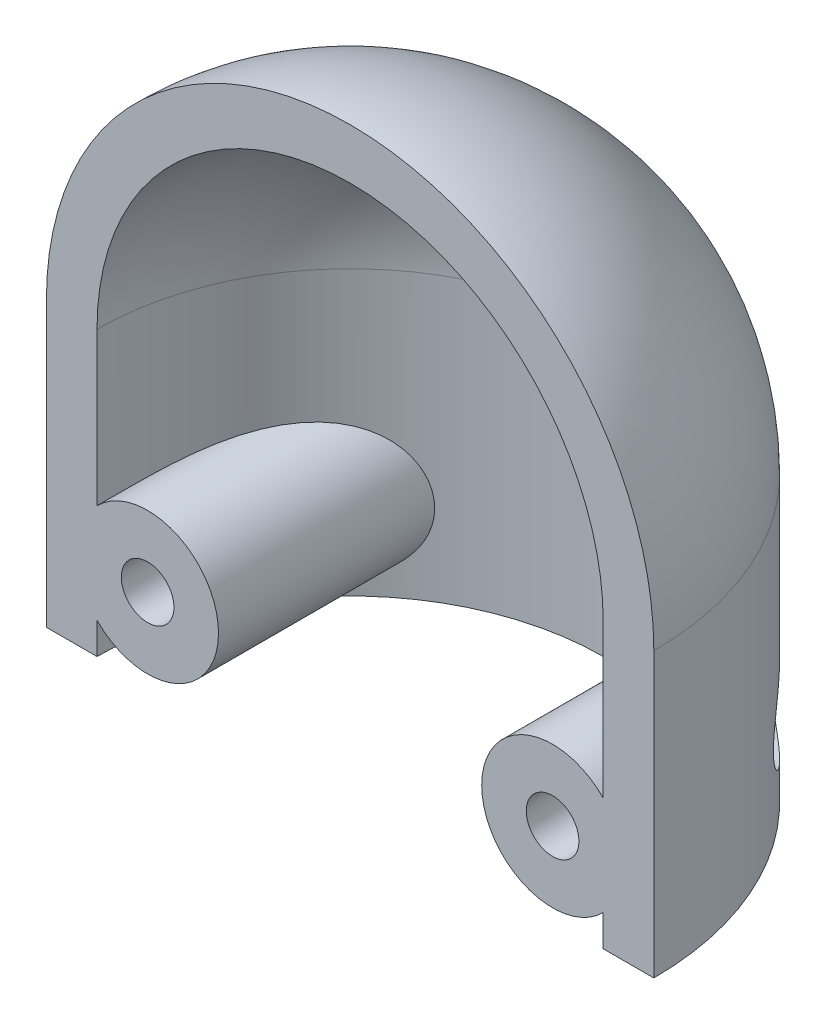
ISO-10303-21;
HEADER;
FILE_DESCRIPTION(('STEP AP214'),'2;1');
FILE_NAME('part.step','',(''),(''),'','','');
FILE_SCHEMA(('AUTOMOTIVE_DESIGN { 1 0 10303 214 1 1 1 1 }'));
ENDSEC;
DATA;
#1=APPLICATION_CONTEXT('core data for automotive mechanical design processes');
#2=APPLICATION_PROTOCOL_DEFINITION('international standard','automotive_design',2000,#1);
#3=PRODUCT_CONTEXT('',#1,'mechanical');
#4=PRODUCT('Part','Part','',(#3));
#5=PRODUCT_RELATED_PRODUCT_CATEGORY('part','',(#4));
#6=PRODUCT_DEFINITION_FORMATION('','',#4);
#7=PRODUCT_DEFINITION_CONTEXT('part definition',#1,'design');
#8=PRODUCT_DEFINITION('design','',#6,#7);
#9=PRODUCT_DEFINITION_SHAPE('','',#8);
#10=(LENGTH_UNIT() NAMED_UNIT(*) SI_UNIT(.MILLI.,.METRE.));
#11=(NAMED_UNIT(*) PLANE_ANGLE_UNIT() SI_UNIT($,.RADIAN.));
#12=(NAMED_UNIT(*) SI_UNIT($,.STERADIAN.) SOLID_ANGLE_UNIT());
#13=UNCERTAINTY_MEASURE_WITH_UNIT(LENGTH_MEASURE(1.E-05),#10,'distance_accuracy_value','');
#14=(GEOMETRIC_REPRESENTATION_CONTEXT(3) GLOBAL_UNCERTAINTY_ASSIGNED_CONTEXT((#13)) GLOBAL_UNIT_ASSIGNED_CONTEXT((#10,
#11,#12)) REPRESENTATION_CONTEXT('',''));
#15=CARTESIAN_POINT('',(0.,0.,0.));
#16=DIRECTION('',(0.,0.,1.));
#17=DIRECTION('',(1.,0.,0.));
#18=AXIS2_PLACEMENT_3D('',#15,#16,#17);
#19=CARTESIAN_POINT('',(0.,26.5,0.));
#20=DIRECTION('',(0.,1.,0.));
#21=DIRECTION('',(-1.,0.,0.));
#22=AXIS2_PLACEMENT_3D('',#19,#20,#21);
#23=CYLINDRICAL_SURFACE('',#22,15.);
#24=CARTESIAN_POINT('',(-7.75,1.5,-12.8427995390413));
#25=CARTESIAN_POINT('',(-7.75000762208717,1.38797182523697,-12.8427963613873));
#26=CARTESIAN_POINT('',(-7.758414467191,1.27586634677356,-12.8377334470978));
#27=CARTESIAN_POINT('',(-7.79161643382535,1.05497367886992,-12.8176078864283));
#28=CARTESIAN_POINT('',(-7.81642829847334,0.9461899984808,-12.8025350237309));
#29=CARTESIAN_POINT('',(-7.88105118267554,0.735357392987198,-12.7628544318796));
#30=CARTESIAN_POINT('',(-7.92082247741085,0.633291464988553,-12.7382719506711));
#31=CARTESIAN_POINT('',(-8.01342666785225,0.438063936677656,-12.68021943223));
#32=CARTESIAN_POINT('',(-8.066259155457,0.344902058281475,-12.6467496726809));
#33=CARTESIAN_POINT('',(-8.18512212239316,0.165544343980721,-12.5701615860699));
#34=CARTESIAN_POINT('',(-8.25161163122103,0.0798019013259881,-12.5266986903291));
#35=CARTESIAN_POINT('',(-8.39355780872431,-0.0789871112806406,-12.4320339363226));
#36=CARTESIAN_POINT('',(-8.46901709972404,-0.152029953046487,-12.3808298137067));
#37=CARTESIAN_POINT('',(-8.63644206427916,-0.293518917112046,-12.2647257516888));
#38=CARTESIAN_POINT('',(-8.72928345785668,-0.36017356971733,-12.1989115197225));
#39=CARTESIAN_POINT('',(-8.91992118989995,-0.476981790072268,-12.0602223353533));
#40=CARTESIAN_POINT('',(-9.01772170773984,-0.52712116337164,-11.9873413785499));
#41=CARTESIAN_POINT('',(-9.26027469544716,-0.630648225693211,-11.8016874308016));
#42=CARTESIAN_POINT('',(-9.40633434037848,-0.675327516485132,-11.6857318075432));
#43=CARTESIAN_POINT('',(-9.69747166749262,-0.734529226455988,-11.4452992210054));
#44=CARTESIAN_POINT('',(-9.84254782671347,-0.749012375762469,-11.3208113785472));
#45=CARTESIAN_POINT('',(-10.1297640230407,-0.750902856037345,-11.0646027701659));
#46=CARTESIAN_POINT('',(-10.2718370193799,-0.737938175469115,-10.9328065076905));
#47=CARTESIAN_POINT('',(-10.5485154443119,-0.686654674231214,-10.6661037265125));
#48=CARTESIAN_POINT('',(-10.6831133166757,-0.6483106869279,-10.5311942489731));
#49=CARTESIAN_POINT('',(-10.8916943244292,-0.567490373466137,-10.3142610691804));
#50=CARTESIAN_POINT('',(-10.9687272565182,-0.53254756143676,-10.2322702265115));
#51=CARTESIAN_POINT('',(-11.1189243025862,-0.453893328673837,-10.0688540918857));
#52=CARTESIAN_POINT('',(-11.1920870047217,-0.410178735528303,-9.98742901559951));
#53=CARTESIAN_POINT('',(-11.3339586041759,-0.31394446160162,-9.82613374434838));
#54=CARTESIAN_POINT('',(-11.4026734466048,-0.261436885380196,-9.74626157806181));
#55=CARTESIAN_POINT('',(-11.5351556259468,-0.147252063419685,-9.58909457220706));
#56=CARTESIAN_POINT('',(-11.5989265745655,-0.0855816094336713,-9.51179787515377));
#57=CARTESIAN_POINT('',(-11.7259024608602,0.0531616309501117,-9.35490331839696));
#58=CARTESIAN_POINT('',(-11.7886130739128,0.131091634306942,-9.27565454790044));
#59=CARTESIAN_POINT('',(-11.905774959011,0.299570495036066,-9.12477957314635));
#60=CARTESIAN_POINT('',(-11.9602370566257,0.390102508227219,-9.05314341541148));
#61=CARTESIAN_POINT('',(-12.0471342693078,0.562556762662054,-8.9370333495969));
#62=CARTESIAN_POINT('',(-12.0817565830407,0.641692590421307,-8.89009776202986));
#63=CARTESIAN_POINT('',(-12.1428249918714,0.808174952435014,-8.80650212379489));
#64=CARTESIAN_POINT('',(-12.1692850803419,0.89550709572511,-8.76982449700521));
#65=CARTESIAN_POINT('',(-12.2073238944032,1.05773859965585,-8.71677007308812));
#66=CARTESIAN_POINT('',(-12.2208766767247,1.13129058500771,-8.69772701962814));
#67=CARTESIAN_POINT('',(-12.2406156689788,1.28126913288453,-8.66992660206629));
#68=CARTESIAN_POINT('',(-12.2468093542911,1.35769269688232,-8.66115880047505));
#69=CARTESIAN_POINT('',(-12.2512883686376,1.5114757151513,-8.65482248793885));
#70=CARTESIAN_POINT('',(-12.2495504808844,1.5888372550089,-8.65728685504324));
#71=CARTESIAN_POINT('',(-12.2382829483405,1.74184556928302,-8.67320690398283));
#72=CARTESIAN_POINT('',(-12.2287477262931,1.81749107644349,-8.68667045327755));
#73=CARTESIAN_POINT('',(-12.200197929674,1.97915442316753,-8.72673325136684));
#74=CARTESIAN_POINT('',(-12.1797250336917,2.06440759708521,-8.7553442564762));
#75=CARTESIAN_POINT('',(-12.1306729437797,2.2280588035925,-8.82318099932327));
#76=CARTESIAN_POINT('',(-12.1020791317742,2.30644413770852,-8.86242587267679));
#77=CARTESIAN_POINT('',(-12.0231363150185,2.49192658661641,-8.9694166032298));
#78=CARTESIAN_POINT('',(-11.9689406125562,2.59468207911306,-9.04178839245198));
#79=CARTESIAN_POINT('',(-11.8501850779473,2.78529253088623,-9.1968862192711));
#80=CARTESIAN_POINT('',(-11.7855999705801,2.87311004908175,-9.27963739672746));
#81=CARTESIAN_POINT('',(-11.6637547402731,3.01696455708871,-9.43207959171529));
#82=CARTESIAN_POINT('',(-11.6080980947538,3.07571277380018,-9.50053990398667));
#83=CARTESIAN_POINT('',(-11.4925379589781,3.18558391158784,-9.64000904100759));
#84=CARTESIAN_POINT('',(-11.4326322540366,3.2367028123987,-9.71101918511219));
#85=CARTESIAN_POINT('',(-11.3090425810017,3.33166083192978,-9.85467082824277));
#86=CARTESIAN_POINT('',(-11.2453565190137,3.37549586416142,-9.92731321724305));
#87=CARTESIAN_POINT('',(-11.114589898621,3.45603815044758,-10.0735066714752));
#88=CARTESIAN_POINT('',(-11.0475080107326,3.49274258520133,-10.1470580839423));
#89=CARTESIAN_POINT('',(-10.8367905328854,3.59456762242455,-10.3733935330284));
#90=CARTESIAN_POINT('',(-10.6880074519451,3.64809836722089,-10.5267907299571));
#91=CARTESIAN_POINT('',(-10.3799811689671,3.72333164714998,-10.830640189607));
#92=CARTESIAN_POINT('',(-10.2207463937626,3.74505950233013,-10.9810947008926));
#93=CARTESIAN_POINT('',(-9.91514164530783,3.75293276536289,-11.2573118326919));
#94=CARTESIAN_POINT('',(-9.76958311412953,3.74310849553191,-11.3838424456739));
#95=CARTESIAN_POINT('',(-9.47669723114219,3.69332101381502,-11.6287778574669));
#96=CARTESIAN_POINT('',(-9.3293719656184,3.65339045289143,-11.747191307859));
#97=CARTESIAN_POINT('',(-9.06844819852549,3.55184952093557,-11.9492553801726));
#98=CARTESIAN_POINT('',(-8.95413377763391,3.49637117167228,-12.0350525794957));
#99=CARTESIAN_POINT('',(-8.73194445456281,3.36313218595764,-12.1972117999659));
#100=CARTESIAN_POINT('',(-8.62406200567624,3.28539830959667,-12.2735849956737));
#101=CARTESIAN_POINT('',(-8.43607143439272,3.12160203570075,-12.4033721943829));
#102=CARTESIAN_POINT('',(-8.35427792309176,3.0388459043313,-12.4585052228026));
#103=CARTESIAN_POINT('',(-8.20223910146742,2.85812233817054,-12.5591234421431));
#104=CARTESIAN_POINT('',(-8.13199365838761,2.76015507827134,-12.6046087439759));
#105=CARTESIAN_POINT('',(-8.00627469768697,2.55004593601875,-12.6848415316516));
#106=CARTESIAN_POINT('',(-7.95089902171334,2.43781699929244,-12.7195181260695));
#107=CARTESIAN_POINT('',(-7.88199266077725,2.26192669704788,-12.7622456736738));
#108=CARTESIAN_POINT('',(-7.8613860924915,2.2020514455937,-12.7749386963167));
#109=CARTESIAN_POINT('',(-7.82517900939855,2.08024313294217,-12.7971491203836));
#110=CARTESIAN_POINT('',(-7.80957645485839,2.01831092159104,-12.8066678157879));
#111=CARTESIAN_POINT('',(-7.78120784000645,1.88111179668599,-12.8239282608265));
#112=CARTESIAN_POINT('',(-7.76953012736241,1.80553104977886,-12.83099728191));
#113=CARTESIAN_POINT('',(-7.7539240086002,1.65331219726239,-12.8404337599383));
#114=CARTESIAN_POINT('',(-7.7499947832992,1.5766742042896,-12.8428017138879));
#115=CARTESIAN_POINT('',(-7.75,1.5,-12.8427995390413));
#116=B_SPLINE_CURVE_WITH_KNOTS('',3,(#24,#25,#26,#27,#28,#29,#30,#31,#32,#33,#34,#35,#36,#37,
#38,#39,#40,#41,#42,#43,#44,#45,#46,#47,#48,#49,#50,#51,#52,#53,#54,#55,#56,#57,#58,#59,#60,#61,
#62,#63,#64,#65,#66,#67,#68,#69,#70,#71,#72,#73,#74,#75,#76,#77,#78,#79,#80,#81,#82,#83,#84,#85,
#86,#87,#88,#89,#90,#91,#92,#93,#94,#95,#96,#97,#98,#99,#100,#101,#102,#103,#104,#105,#106,#107,
#108,#109,#110,#111,#112,#113,#114,#115),.UNSPECIFIED.,.T.,.F.,(4,2,2,2,2,2,2,2,2,2,2,2,2,2,2,2,
2,2,2,2,2,2,2,2,2,2,2,2,2,2,2,2,2,2,2,2,2,2,2,2,2,2,2,2,2,4),(0.,0.335797696640248,
0.671938641697546,1.00719319393683,1.34243727235888,1.69168174680971,2.04102857549537,
2.43518702796973,2.82968337069656,3.40186235638781,3.9747849939071,4.55552235439675,
5.13683645028342,5.48990937301836,5.84311021939127,6.19582878177244,6.5482871927541,
6.93025232973985,7.31171173865977,7.60569557782542,7.89917257149958,8.12974527891161,
8.36008356950098,8.59109652314882,8.82227485981811,9.09743497581919,9.37309356833876,
9.78144235067957,10.1908000159011,10.5083924243921,10.8261516016459,11.1440884546436,
11.4621507590414,12.1203635941702,12.7780521039078,13.3552275378017,13.9317779105019,
14.3899903569111,14.8476541451197,15.2323164449258,15.6169743223498,16.0041044180595,
16.1975924730243,16.3910015579725,16.6208521620539,16.8506784646482),.UNSPECIFIED.);
#117=CARTESIAN_POINT('',(-7.75,1.5,-12.8427995390413));
#118=VERTEX_POINT('',#117);
#119=EDGE_CURVE('E131',#118,#118,#116,.T.);
#120=ORIENTED_EDGE('',*,*,#119,.F.);
#121=EDGE_LOOP('',(#120));
#122=FACE_BOUND('',#121,.T.);
#123=CARTESIAN_POINT('',(0.,-2.5,0.));
#124=DIRECTION('',(0.,1.,0.));
#125=DIRECTION('',(-1.,0.,0.));
#126=AXIS2_PLACEMENT_3D('',#123,#124,#125);
#127=CIRCLE('',#126,15.);
#128=CARTESIAN_POINT('',(15.,-2.5,1.04744440165294E-13));
#129=VERTEX_POINT('',#128);
#130=CARTESIAN_POINT('',(-15.,-2.5,0.));
#131=VERTEX_POINT('',#130);
#132=EDGE_CURVE('E52',#129,#131,#127,.T.);
#133=ORIENTED_EDGE('',*,*,#132,.T.);
#134=DIRECTION('',(0.,-1.,0.));
#135=VECTOR('',#134,1.);
#136=CARTESIAN_POINT('',(-15.,11.5,0.));
#137=LINE('',#136,#135);
#138=CARTESIAN_POINT('',(-15.,11.5,0.));
#139=VERTEX_POINT('',#138);
#140=EDGE_CURVE('E141',#139,#131,#137,.T.);
#141=ORIENTED_EDGE('',*,*,#140,.F.);
#142=CARTESIAN_POINT('',(0.,11.5,0.));
#143=DIRECTION('',(0.,1.,0.));
#144=DIRECTION('',(-1.,0.,0.));
#145=AXIS2_PLACEMENT_3D('',#142,#143,#144);
#146=CIRCLE('',#145,15.);
#147=CARTESIAN_POINT('',(15.,11.5,1.04744440165294E-13));
#148=VERTEX_POINT('',#147);
#149=EDGE_CURVE('E11',#148,#139,#146,.T.);
#150=ORIENTED_EDGE('',*,*,#149,.F.);
#151=DIRECTION('',(0.,-1.,0.));
#152=VECTOR('',#151,1.);
#153=CARTESIAN_POINT('',(15.,11.5,1.04744440165294E-13));
#154=LINE('',#153,#152);
#155=EDGE_CURVE('E203',#148,#129,#154,.T.);
#156=ORIENTED_EDGE('',*,*,#155,.T.);
#157=EDGE_LOOP('',(#133,#141,#150,#156));
#158=FACE_BOUND('',#157,.T.);
#159=CARTESIAN_POINT('',(12.25,1.5,-8.6566448465904));
#160=CARTESIAN_POINT('',(12.2499950326901,1.57782352219515,-8.65665284821823));
#161=CARTESIAN_POINT('',(12.2459232142513,1.65569384608021,-8.66242271647153));
#162=CARTESIAN_POINT('',(12.230014334885,1.80904600526875,-8.68486759220781));
#163=CARTESIAN_POINT('',(12.2181666680438,1.88452443051756,-8.70155749403788));
#164=CARTESIAN_POINT('',(12.1840397576286,2.04869166464825,-8.74929792434371));
#165=CARTESIAN_POINT('',(12.1599551404414,2.13627851569056,-8.78281253966669));
#166=CARTESIAN_POINT('',(12.1034503181377,2.30364302305097,-8.86051921926181));
#167=CARTESIAN_POINT('',(12.0710141890666,2.38340535452322,-8.9047316714516));
#168=CARTESIAN_POINT('',(11.9813674641893,2.57364459926989,-9.02523815736426));
#169=CARTESIAN_POINT('',(11.9199606826938,2.6790266412564,-9.10639076401966));
#170=CARTESIAN_POINT('',(11.7862358162135,2.87324835632554,-9.2788274265066));
#171=CARTESIAN_POINT('',(11.7138918542877,2.96204765084072,-9.3701353703074));
#172=CARTESIAN_POINT('',(11.579073845292,3.1050542026109,-9.5359107132621));
#173=CARTESIAN_POINT('',(11.5184071435694,3.1624457560189,-9.60915060946197));
#174=CARTESIAN_POINT('',(11.3927111160519,3.26908312865416,-9.75784864425308));
#175=CARTESIAN_POINT('',(11.3276796834669,3.31832497381431,-9.83330784405217));
#176=CARTESIAN_POINT('',(11.1937154487622,3.40894837086086,-9.98554079319531));
#177=CARTESIAN_POINT('',(11.124780494699,3.45032553123672,-10.0623152510292));
#178=CARTESIAN_POINT('',(10.9833870813884,3.52530391238552,-10.2164649498003));
#179=CARTESIAN_POINT('',(10.9109272786193,3.5589021396101,-10.2938404102205));
#180=CARTESIAN_POINT('',(10.7608901687556,3.61901966816669,-10.4506127188987));
#181=CARTESIAN_POINT('',(10.6832284941124,3.64533024919727,-10.5300093703414));
#182=CARTESIAN_POINT('',(10.5249795979124,3.68944001070644,-10.6881882327083));
#183=CARTESIAN_POINT('',(10.4443924802098,3.7072394930149,-10.7669704653242));
#184=CARTESIAN_POINT('',(10.198960296121,3.74730083480611,-11.0014566677737));
#185=CARTESIAN_POINT('',(10.030136614847,3.75635042294381,-11.1556229298265));
#186=CARTESIAN_POINT('',(9.72132592014719,3.73691134699333,-11.4249372597782));
#187=CARTESIAN_POINT('',(9.58230201431533,3.71554856740839,-11.5417354708387));
#188=CARTESIAN_POINT('',(9.30447354453634,3.64458118954044,-11.7668404064225));
#189=CARTESIAN_POINT('',(9.16566891488,3.59500982532485,-11.8751569531234));
#190=CARTESIAN_POINT('',(8.92021298783092,3.47770420629499,-12.0602125860143));
#191=CARTESIAN_POINT('',(8.81254310358766,3.41535078194834,-12.1390034509751));
#192=CARTESIAN_POINT('',(8.60492982890351,3.26982954558338,-12.2870407801069));
#193=CARTESIAN_POINT('',(8.50497842400067,3.18668371424676,-12.3562972044785));
#194=CARTESIAN_POINT('',(8.33164664541117,3.01385508916271,-12.4736912065236));
#195=CARTESIAN_POINT('',(8.25652851858123,2.92701428028842,-12.5234382340156));
#196=CARTESIAN_POINT('',(8.11862784305336,2.73953941475217,-12.6132730492034));
#197=CARTESIAN_POINT('',(8.05584206675729,2.63890897881981,-12.6533633648577));
#198=CARTESIAN_POINT('',(7.9455900338652,2.42542023126239,-12.7228887451452));
#199=CARTESIAN_POINT('',(7.89820526498089,2.31250096579812,-12.752267229367));
#200=CARTESIAN_POINT('',(7.82207998085259,2.0781972912796,-12.7991051753051));
#201=CARTESIAN_POINT('',(7.79333143239241,1.95681655459867,-12.8165697727193));
#202=CARTESIAN_POINT('',(7.75813342568245,1.72191719561597,-12.837902482352));
#203=CARTESIAN_POINT('',(7.74978418106783,1.60878486691092,-12.8429295672578));
#204=CARTESIAN_POINT('',(7.75022409191845,1.38258585045922,-12.8426645194796));
#205=CARTESIAN_POINT('',(7.75900761513857,1.26951915335949,-12.8373757780319));
#206=CARTESIAN_POINT('',(7.79252491809638,1.05139561323473,-12.8170553752956));
#207=CARTESIAN_POINT('',(7.81660473494189,0.946199402304765,-12.8024230520538));
#208=CARTESIAN_POINT('',(7.87889632283228,0.741821612838693,-12.7641810748263));
#209=CARTESIAN_POINT('',(7.91710854974668,0.642640228443143,-12.7405711312485));
#210=CARTESIAN_POINT('',(8.00731387428296,0.449565639019899,-12.6840777789236));
#211=CARTESIAN_POINT('',(8.05970273542857,0.355937000743736,-12.6509259690177));
#212=CARTESIAN_POINT('',(8.17535913566982,0.179262623211943,-12.576494946528));
#213=CARTESIAN_POINT('',(8.23863007708947,0.0962202079609135,-12.5352131914986));
#214=CARTESIAN_POINT('',(8.3800920355682,-0.0655728629287526,-12.4411382429733));
#215=CARTESIAN_POINT('',(8.45913051529441,-0.143158822330134,-12.3876226639989));
#216=CARTESIAN_POINT('',(8.6243642536842,-0.283792775560799,-12.2731600992072));
#217=CARTESIAN_POINT('',(8.71056244516793,-0.346834771430502,-12.212210063189));
#218=CARTESIAN_POINT('',(8.90116646000616,-0.467142344628997,-12.0741498424327));
#219=CARTESIAN_POINT('',(9.00632741640935,-0.522009517561736,-11.9959979259246));
#220=CARTESIAN_POINT('',(9.21939035856734,-0.613437571924881,-11.8330434254264));
#221=CARTESIAN_POINT('',(9.32729462197704,-0.649982682684739,-11.7482351843805));
#222=CARTESIAN_POINT('',(9.59503196997522,-0.719395654811384,-11.5315809515358));
#223=CARTESIAN_POINT('',(9.75501747564844,-0.742144396215314,-11.396638313927));
#224=CARTESIAN_POINT('',(10.0698656584119,-0.754447014603653,-11.1194450365421));
#225=CARTESIAN_POINT('',(10.2247196827799,-0.743947446306894,-10.9771829925308));
#226=CARTESIAN_POINT('',(10.5276419328959,-0.692712984289556,-10.6870616085301));
#227=CARTESIAN_POINT('',(10.6755964535384,-0.651588693614773,-10.539153666159));
#228=CARTESIAN_POINT('',(10.9600183827601,-0.540637937519228,-10.2430543659288));
#229=CARTESIAN_POINT('',(11.0964842838353,-0.470807712437677,-10.0948629734773));
#230=CARTESIAN_POINT('',(11.3398140713929,-0.312682961493306,-9.82028447898009));
#231=CARTESIAN_POINT('',(11.4482596127768,-0.22766712067239,-9.69343756852415));
#232=CARTESIAN_POINT('',(11.6009952865358,-0.0824735202590458,-9.50911767525677));
#233=CARTESIAN_POINT('',(11.6502324047351,-0.0311569369374382,-9.44869454145261));
#234=CARTESIAN_POINT('',(11.7449692014345,0.077751097337043,-9.33067024617683));
#235=CARTESIAN_POINT('',(11.790470929249,0.135339066776817,-9.27306754445216));
#236=CARTESIAN_POINT('',(11.8858925426818,0.269553466183997,-9.15055887119057));
#237=CARTESIAN_POINT('',(11.9348535098408,0.347677433499964,-9.08652203881295));
#238=CARTESIAN_POINT('',(12.0248733228771,0.514434949049322,-8.96705074152035));
#239=CARTESIAN_POINT('',(12.0659419459086,0.603055271254963,-8.91160564974331));
#240=CARTESIAN_POINT('',(12.1296630830227,0.769857273553376,-8.82459672165388));
#241=CARTESIAN_POINT('',(12.1543800956783,0.845891183028248,-8.79046688206301));
#242=CARTESIAN_POINT('',(12.1960995983672,1.00374947567758,-8.73249344454681));
#243=CARTESIAN_POINT('',(12.2131198809968,1.08555999312127,-8.7086261290064));
#244=CARTESIAN_POINT('',(12.2335915943652,1.22331402691309,-8.67982865285994));
#245=CARTESIAN_POINT('',(12.2397163253898,1.27810072204719,-8.67118188533491));
#246=CARTESIAN_POINT('',(12.2479223258831,1.38858360832576,-8.65958709031449));
#247=CARTESIAN_POINT('',(12.2500035565013,1.4442798082037,-8.65663911757396));
#248=CARTESIAN_POINT('',(12.25,1.5,-8.6566448465904));
#249=B_SPLINE_CURVE_WITH_KNOTS('',3,(#159,#160,#161,#162,#163,#164,#165,#166,#167,#168,#169,
#170,#171,#172,#173,#174,#175,#176,#177,#178,#179,#180,#181,#182,#183,#184,#185,#186,#187,#188,
#189,#190,#191,#192,#193,#194,#195,#196,#197,#198,#199,#200,#201,#202,#203,#204,#205,#206,#207,
#208,#209,#210,#211,#212,#213,#214,#215,#216,#217,#218,#219,#220,#221,#222,#223,#224,#225,#226,
#227,#228,#229,#230,#231,#232,#233,#234,#235,#236,#237,#238,#239,#240,#241,#242,#243,#244,#245,
#246,#247,#248),.UNSPECIFIED.,.T.,.F.,(4,2,2,2,2,2,2,2,2,2,2,2,2,2,2,2,2,2,2,2,2,2,2,2,2,2,2,2,
2,2,2,2,2,2,2,2,2,2,2,2,2,2,2,2,4),(0.,0.23324840584016,0.466815615210154,0.755668537899043,
1.04507635294594,1.48215713144369,1.9202886953823,2.25310822199327,2.58608956725691,
2.91925630109326,3.25255103437521,3.59458522578984,3.93660728671512,4.61927700566386,
5.16581087592986,5.71170217411504,6.15181377234304,6.5914620592684,6.96529365430689,
7.33902728013997,7.71470732702575,8.09022532767693,8.42915470646195,8.76797268400467,
9.09319930813916,9.41843642403239,9.75390656251136,10.0894817783142,10.4570622039011,
10.8247939504817,11.2493565503958,11.6742839668121,12.3024523415108,12.9316309831334,
13.568949305055,14.206351124154,14.7662291081964,15.0459239653959,15.3254643360671,
15.6613663143252,15.9968494511562,16.2567343486564,16.5160153577232,16.6830152656065,
16.8500167780413),.UNSPECIFIED.);
#250=CARTESIAN_POINT('',(12.25,1.5,-8.6566448465904));
#251=VERTEX_POINT('',#250);
#252=EDGE_CURVE('E43',#251,#251,#249,.T.);
#253=ORIENTED_EDGE('',*,*,#252,.T.);
#254=EDGE_LOOP('',(#253));
#255=FACE_BOUND('',#254,.T.);
#256=ADVANCED_FACE('F39',(#122,#158,#255),#23,.T.);
#257=CARTESIAN_POINT('',(0.,26.5,0.));
#258=DIRECTION('',(0.,1.,0.));
#259=DIRECTION('',(-1.,0.,0.));
#260=AXIS2_PLACEMENT_3D('',#257,#258,#259);
#261=CYLINDRICAL_SURFACE('',#260,12.5);
#262=DIRECTION('',(0.,1.,0.));
#263=VECTOR('',#262,1.);
#264=CARTESIAN_POINT('',(12.5,-2.5,0.));
#265=LINE('',#264,#263);
#266=CARTESIAN_POINT('',(12.5,-2.5,0.));
#267=VERTEX_POINT('',#266);
#268=CARTESIAN_POINT('',(12.5,-0.949489742783177,0.));
#269=VERTEX_POINT('',#268);
#270=EDGE_CURVE('E60',#267,#269,#265,.T.);
#271=ORIENTED_EDGE('',*,*,#270,.T.);
#272=CARTESIAN_POINT('',(12.5,3.94948974278318,0.));
#273=CARTESIAN_POINT('',(12.5000032689768,3.94946550431468,-0.129949920805775));
#274=CARTESIAN_POINT('',(12.4979736762754,3.95155743003664,-0.259893383849801));
#275=CARTESIAN_POINT('',(12.4898742887543,3.95979397936944,-0.519500025286916));
#276=CARTESIAN_POINT('',(12.4838053212185,3.96593777313528,-0.649163255618898));
#277=CARTESIAN_POINT('',(12.4676690964799,3.98208214615698,-0.907732511575002));
#278=CARTESIAN_POINT('',(12.4576099884553,3.99207486344801,-1.0366395404333));
#279=CARTESIAN_POINT('',(12.4335379863453,4.01558641661404,-1.29375795721268));
#280=CARTESIAN_POINT('',(12.4195249034134,4.02910542090646,-1.42196931160934));
#281=CARTESIAN_POINT('',(12.3715879444113,4.0743970527811,-1.8056245993548));
#282=CARTESIAN_POINT('',(12.3317842738531,4.11088491468975,-2.05980501245618));
#283=CARTESIAN_POINT('',(12.2369137876663,4.19260431392956,-2.56394624043416));
#284=CARTESIAN_POINT('',(12.1818373906728,4.23784133464944,-2.81390430163543));
#285=CARTESIAN_POINT('',(12.0350022021179,4.34955529715699,-3.39516634343661));
#286=CARTESIAN_POINT('',(11.9371467974808,4.41795238796141,-3.72457151256851));
#287=CARTESIAN_POINT('',(11.7146088424295,4.55403896883603,-4.37446887405977));
#288=CARTESIAN_POINT('',(11.5899152109663,4.62172815448275,-4.69495732294756));
#289=CARTESIAN_POINT('',(11.3141019447322,4.74746994552965,-5.32532208659618));
#290=CARTESIAN_POINT('',(11.1630571292854,4.8055489511032,-5.63522555357871));
#291=CARTESIAN_POINT('',(10.8345988037807,4.90335339718789,-6.24345844950669));
#292=CARTESIAN_POINT('',(10.6572156449645,4.94309974983079,-6.54180070859868));
#293=CARTESIAN_POINT('',(10.2894330241383,4.99260665157298,-7.10512165081977));
#294=CARTESIAN_POINT('',(10.1006989093719,5.00419580385658,-7.37099697601008));
#295=CARTESIAN_POINT('',(9.80277097338016,4.99584706602928,-7.75772280531845));
#296=CARTESIAN_POINT('',(9.70098375612123,4.9887741712687,-7.88462438997182));
#297=CARTESIAN_POINT('',(9.49300525564835,4.96466715566951,-8.13382702796182));
#298=CARTESIAN_POINT('',(9.38681457126577,4.94763438518261,-8.25612870255853));
#299=CARTESIAN_POINT('',(9.18719654057608,4.90560100886593,-8.47727202224242));
#300=CARTESIAN_POINT('',(9.09426689457742,4.88219442835078,-8.57686493968552));
#301=CARTESIAN_POINT('',(8.90655706220408,4.82625510559272,-8.77163173526849));
#302=CARTESIAN_POINT('',(8.81177733334373,4.79372459369475,-8.8668066867615));
#303=CARTESIAN_POINT('',(8.62136625007879,4.71866729976663,-9.0520522295462));
#304=CARTESIAN_POINT('',(8.52573599471655,4.67615200302779,-9.14212853905608));
#305=CARTESIAN_POINT('',(8.33476194948801,4.58032678558866,-9.31657155197465));
#306=CARTESIAN_POINT('',(8.23941808393991,4.52702002935227,-9.40093991951364));
#307=CARTESIAN_POINT('',(8.00100760727776,4.37797065653578,-9.60570747200546));
#308=CARTESIAN_POINT('',(7.85895759139686,4.27458857345368,-9.72197776775113));
#309=CARTESIAN_POINT('',(7.65369100451249,4.09865245644419,-9.88325329796159));
#310=CARTESIAN_POINT('',(7.58654351554306,4.03649926487769,-9.9348424943699));
#311=CARTESIAN_POINT('',(7.45573315815934,3.90525947416222,-10.0333800730949));
#312=CARTESIAN_POINT('',(7.39206858020154,3.83617632454892,-10.0803307414632));
#313=CARTESIAN_POINT('',(7.26864688387362,3.69063726856495,-10.1696920402543));
#314=CARTESIAN_POINT('',(7.20892662287515,3.61412487779104,-10.2120617114944));
#315=CARTESIAN_POINT('',(7.09498530290807,3.4546071920387,-10.2915502538201));
#316=CARTESIAN_POINT('',(7.04076155244121,3.37160511050893,-10.3286716983754));
#317=CARTESIAN_POINT('',(6.93874529327064,3.19962187463103,-10.3974805820073));
#318=CARTESIAN_POINT('',(6.8909517893159,3.11064164876304,-10.4291688622188));
#319=CARTESIAN_POINT('',(6.80267781919498,2.92739924737454,-10.4869614717365));
#320=CARTESIAN_POINT('',(6.7621962505988,2.83313787091249,-10.5130666429246));
#321=CARTESIAN_POINT('',(6.69398833884309,2.65255179886303,-10.5566065123105));
#322=CARTESIAN_POINT('',(6.66529252553912,2.56675593405978,-10.5747233665638));
#323=CARTESIAN_POINT('',(6.61446554566146,2.3924144054248,-10.6065897554476));
#324=CARTESIAN_POINT('',(6.59233653581271,2.30386784871185,-10.6203378553598));
#325=CARTESIAN_POINT('',(6.55501192461527,2.12482627186049,-10.6434160101528));
#326=CARTESIAN_POINT('',(6.53981090934499,2.03433283124133,-10.6527495150609));
#327=CARTESIAN_POINT('',(6.5165394569576,1.85208116737561,-10.6669998996607));
#328=CARTESIAN_POINT('',(6.50847153712873,1.76032250922298,-10.6719152201737));
#329=CARTESIAN_POINT('',(6.49586975615428,1.4981239929929,-10.6796002479808));
#330=CARTESIAN_POINT('',(6.50014327652568,1.32698595377063,-10.6770104750815));
#331=CARTESIAN_POINT('',(6.53343671114826,0.988183999328527,-10.6566669577457));
#332=CARTESIAN_POINT('',(6.5624515681846,0.820519381302749,-10.6389163122427));
#333=CARTESIAN_POINT('',(6.64323388846601,0.495053862830099,-10.5886570863121));
#334=CARTESIAN_POINT('',(6.6947517902953,0.337165870824839,-10.5563102527905));
#335=CARTESIAN_POINT('',(6.81789266052843,0.0333440680870407,-10.477197301208));
#336=CARTESIAN_POINT('',(6.88951693012627,-0.112588968184506,-10.4304302499158));
#337=CARTESIAN_POINT('',(7.05246772445579,-0.394615985339778,-10.3209811271514));
#338=CARTESIAN_POINT('',(7.14443712968096,-0.53012884098649,-10.257763879079));
#339=CARTESIAN_POINT('',(7.34195928674923,-0.782663241862672,-10.1173267689085));
#340=CARTESIAN_POINT('',(7.44751577308589,-0.899679683463064,-10.04010305465));
#341=CARTESIAN_POINT('',(7.6786082482816,-1.12481651202686,-9.86468402139294));
#342=CARTESIAN_POINT('',(7.80508827495892,-1.23093308793698,-9.76517365000481));
#343=CARTESIAN_POINT('',(8.06380585732366,-1.42008136602556,-9.552647112686));
#344=CARTESIAN_POINT('',(8.19604682488425,-1.50309916711668,-9.43962287220445));
#345=CARTESIAN_POINT('',(8.4300021564302,-1.63023234690476,-9.23057452305302));
#346=CARTESIAN_POINT('',(8.53144975620328,-1.6789031267607,-9.13695350414763));
#347=CARTESIAN_POINT('',(8.7336867943039,-1.76473884929558,-8.94383906377006));
#348=CARTESIAN_POINT('',(8.83447594111227,-1.80189899451285,-8.84434321426995));
#349=CARTESIAN_POINT('',(9.03431484739842,-1.86578031200197,-8.64011605182261));
#350=CARTESIAN_POINT('',(9.13336177086729,-1.89248574141689,-8.53537710917752));
#351=CARTESIAN_POINT('',(9.32870682913297,-1.93647955437855,-8.32143228708221));
#352=CARTESIAN_POINT('',(9.42500406340773,-1.95376488561905,-8.21222497209495));
#353=CARTESIAN_POINT('',(9.66140816029781,-1.98652597230669,-7.93441989372602));
#354=CARTESIAN_POINT('',(9.79938886190613,-1.99679138379895,-7.76338761862211));
#355=CARTESIAN_POINT('',(10.0662362206185,-2.00191874036026,-7.41412667589926));
#356=CARTESIAN_POINT('',(10.1950980233109,-1.99677254332934,-7.23589425344066));
#357=CARTESIAN_POINT('',(10.4432024247073,-1.97406475376851,-6.87298787592764));
#358=CARTESIAN_POINT('',(10.5624191830081,-1.95647096492468,-6.68829839952153));
#359=CARTESIAN_POINT('',(10.7904382198747,-1.91155472286993,-6.31383529952431));
#360=CARTESIAN_POINT('',(10.8992415377301,-1.88423324179634,-6.12406218571855));
#361=CARTESIAN_POINT('',(11.1674648324335,-1.80402575695959,-5.6265577561305));
#362=CARTESIAN_POINT('',(11.3188236798922,-1.74557163617441,-5.31535998448839));
#363=CARTESIAN_POINT('',(11.5947702204295,-1.6192512647231,-4.6830006209259));
#364=CARTESIAN_POINT('',(11.71933567491,-1.55137727181233,-4.3618310033947));
#365=CARTESIAN_POINT('',(11.9412729750213,-1.4151916375875,-3.71130958880524));
#366=CARTESIAN_POINT('',(12.0387152665639,-1.34688161043259,-3.3819814536644));
#367=CARTESIAN_POINT('',(12.2064303964674,-1.21897306263255,-2.7149777930778));
#368=CARTESIAN_POINT('',(12.2767274766143,-1.15936679889557,-2.37731000339893));
#369=CARTESIAN_POINT('',(12.3606102230856,-1.08435314160156,-1.86919999607865));
#370=CARTESIAN_POINT('',(12.3848172376639,-1.06192693696279,-1.70150281086999));
#371=CARTESIAN_POINT('',(12.4264442791702,-1.02253592723794,-1.36465144913239));
#372=CARTESIAN_POINT('',(12.4438659371417,-1.00556980984315,-1.1954976327488));
#373=CARTESIAN_POINT('',(12.4718489327238,-0.977977867601988,-0.855636844400495));
#374=CARTESIAN_POINT('',(12.4823916358692,-0.967369270982065,-0.684926913464847));
#375=CARTESIAN_POINT('',(12.4964741806594,-0.95308752455011,-0.342819464315739));
#376=CARTESIAN_POINT('',(12.5000093838808,-0.949418968581737,-0.171421565869689));
#377=CARTESIAN_POINT('',(12.5,-0.949489742783177,0.));
#378=B_SPLINE_CURVE_WITH_KNOTS('',3,(#272,#273,#274,#275,#276,#277,#278,#279,#280,#281,#282,
#283,#284,#285,#286,#287,#288,#289,#290,#291,#292,#293,#294,#295,#296,#297,#298,#299,#300,#301,
#302,#303,#304,#305,#306,#307,#308,#309,#310,#311,#312,#313,#314,#315,#316,#317,#318,#319,#320,
#321,#322,#323,#324,#325,#326,#327,#328,#329,#330,#331,#332,#333,#334,#335,#336,#337,#338,#339,
#340,#341,#342,#343,#344,#345,#346,#347,#348,#349,#350,#351,#352,#353,#354,#355,#356,#357,#358,
#359,#360,#361,#362,#363,#364,#365,#366,#367,#368,#369,#370,#371,#372,#373,#374,#375,#376,#377),
.UNSPECIFIED.,.F.,.F.,(4,2,2,2,2,2,2,2,2,2,2,2,2,2,2,2,2,2,2,2,2,2,2,2,2,2,2,2,2,2,2,2,2,2,2,2,
2,2,2,2,2,2,2,2,2,2,2,2,2,2,2,2,4),(0.,0.389806456859172,0.77953310398059,1.1684678658273,
1.55742120681583,2.33618330429002,3.11543506879515,4.16532929178603,5.21565783271618,
6.26305130424574,7.3092470368622,8.28543352427896,8.77358736901523,9.2616750455976,
9.67596777399437,10.090159316672,10.5038767369669,10.9174730149472,11.5465522444562,
11.8613578032418,12.1760074311234,12.4932711608824,12.8103787766522,13.1274372550147,
13.4444478900832,13.7208743613519,13.997391518709,14.2736922180527,14.5500903857681,
15.0610158597501,15.5718369238241,16.0771313108492,16.5824584058033,17.1069036632491,
17.6314933767653,18.2076274291433,18.7841074588311,19.2226522022573,19.6613794794519,
20.100764880296,20.5402925665586,21.1992206737366,21.8584969603282,22.5194847616078,
23.1804065255764,24.2317011013956,25.2838649163253,26.3332699322628,27.3817356071222,
27.8942871212954,28.4067153537348,28.9205260073872,29.4346766505522),.UNSPECIFIED.);
#379=CARTESIAN_POINT('',(12.5,3.94948974278318,0.));
#380=VERTEX_POINT('',#379);
#381=EDGE_CURVE('E108',#380,#269,#378,.T.);
#382=ORIENTED_EDGE('',*,*,#381,.F.);
#383=CARTESIAN_POINT('',(12.5,11.5,0.));
#384=VERTEX_POINT('',#383);
#385=EDGE_CURVE('E98',#380,#384,#265,.T.);
#386=ORIENTED_EDGE('',*,*,#385,.T.);
#387=CARTESIAN_POINT('',(0.,11.5,0.));
#388=DIRECTION('',(0.,1.,0.));
#389=DIRECTION('',(-1.,0.,0.));
#390=AXIS2_PLACEMENT_3D('',#387,#388,#389);
#391=CIRCLE('',#390,12.5);
#392=CARTESIAN_POINT('',(-12.5,11.5,0.));
#393=VERTEX_POINT('',#392);
#394=EDGE_CURVE('E225',#384,#393,#391,.T.);
#395=ORIENTED_EDGE('',*,*,#394,.T.);
#396=DIRECTION('',(0.,1.,0.));
#397=VECTOR('',#396,1.);
#398=CARTESIAN_POINT('',(-12.5,-2.5,0.));
#399=LINE('',#398,#397);
#400=CARTESIAN_POINT('',(-12.5,3.94948974278317,0.));
#401=VERTEX_POINT('',#400);
#402=EDGE_CURVE('E216',#401,#393,#399,.T.);
#403=ORIENTED_EDGE('',*,*,#402,.F.);
#404=CARTESIAN_POINT('',(-12.5,3.94948974278318,0.));
#405=CARTESIAN_POINT('',(-12.5000032689768,3.94946550431468,-0.129949920805775));
#406=CARTESIAN_POINT('',(-12.4979736762754,3.95155743003664,-0.259893383849801));
#407=CARTESIAN_POINT('',(-12.4898742887543,3.95979397936944,-0.519500025286916));
#408=CARTESIAN_POINT('',(-12.4838053212185,3.96593777313528,-0.649163255618898));
#409=CARTESIAN_POINT('',(-12.4676690964799,3.98208214615698,-0.907732511575002));
#410=CARTESIAN_POINT('',(-12.4576099884553,3.99207486344801,-1.0366395404333));
#411=CARTESIAN_POINT('',(-12.4335379863453,4.01558641661404,-1.29375795721268));
#412=CARTESIAN_POINT('',(-12.4195249034134,4.02910542090646,-1.42196931160934));
#413=CARTESIAN_POINT('',(-12.3715879444113,4.0743970527811,-1.8056245993548));
#414=CARTESIAN_POINT('',(-12.3317842738531,4.11088491468975,-2.05980501245618));
#415=CARTESIAN_POINT('',(-12.2369137876663,4.19260431392956,-2.56394624043416));
#416=CARTESIAN_POINT('',(-12.1818373906728,4.23784133464944,-2.81390430163543));
#417=CARTESIAN_POINT('',(-12.0350022021179,4.34955529715699,-3.39516634343661));
#418=CARTESIAN_POINT('',(-11.9371467974808,4.41795238796141,-3.72457151256851));
#419=CARTESIAN_POINT('',(-11.7146088424295,4.55403896883603,-4.37446887405977));
#420=CARTESIAN_POINT('',(-11.5899152109663,4.62172815448275,-4.69495732294756));
#421=CARTESIAN_POINT('',(-11.3141019447322,4.74746994552965,-5.32532208659618));
#422=CARTESIAN_POINT('',(-11.1630571292854,4.8055489511032,-5.63522555357871));
#423=CARTESIAN_POINT('',(-10.8345988037807,4.90335339718789,-6.24345844950669));
#424=CARTESIAN_POINT('',(-10.6572156449645,4.94309974983079,-6.54180070859868));
#425=CARTESIAN_POINT('',(-10.2894330241383,4.99260665157298,-7.10512165081977));
#426=CARTESIAN_POINT('',(-10.1006989093719,5.00419580385658,-7.37099697601008));
#427=CARTESIAN_POINT('',(-9.80277097338016,4.99584706602928,-7.75772280531845));
#428=CARTESIAN_POINT('',(-9.70098375612123,4.9887741712687,-7.88462438997182));
#429=CARTESIAN_POINT('',(-9.49300525564835,4.96466715566951,-8.13382702796182));
#430=CARTESIAN_POINT('',(-9.38681457126577,4.94763438518261,-8.25612870255853));
#431=CARTESIAN_POINT('',(-9.18719654057608,4.90560100886593,-8.47727202224242));
#432=CARTESIAN_POINT('',(-9.09426689457742,4.88219442835078,-8.57686493968552));
#433=CARTESIAN_POINT('',(-8.90655706220408,4.82625510559272,-8.77163173526849));
#434=CARTESIAN_POINT('',(-8.81177733334373,4.79372459369475,-8.8668066867615));
#435=CARTESIAN_POINT('',(-8.62136625007879,4.71866729976663,-9.0520522295462));
#436=CARTESIAN_POINT('',(-8.52573599471655,4.67615200302779,-9.14212853905608));
#437=CARTESIAN_POINT('',(-8.33476194948801,4.58032678558866,-9.31657155197465));
#438=CARTESIAN_POINT('',(-8.23941808393991,4.52702002935227,-9.40093991951364));
#439=CARTESIAN_POINT('',(-8.00100760727776,4.37797065653578,-9.60570747200546));
#440=CARTESIAN_POINT('',(-7.85895759139686,4.27458857345368,-9.72197776775113));
#441=CARTESIAN_POINT('',(-7.65369100451249,4.09865245644419,-9.88325329796159));
#442=CARTESIAN_POINT('',(-7.58654351554306,4.03649926487769,-9.9348424943699));
#443=CARTESIAN_POINT('',(-7.45573315815934,3.90525947416222,-10.0333800730949));
#444=CARTESIAN_POINT('',(-7.39206858020154,3.83617632454892,-10.0803307414632));
#445=CARTESIAN_POINT('',(-7.26864688387362,3.69063726856495,-10.1696920402543));
#446=CARTESIAN_POINT('',(-7.20892662287515,3.61412487779104,-10.2120617114944));
#447=CARTESIAN_POINT('',(-7.09498530290807,3.4546071920387,-10.2915502538201));
#448=CARTESIAN_POINT('',(-7.04076155244121,3.37160511050893,-10.3286716983754));
#449=CARTESIAN_POINT('',(-6.93874529327064,3.19962187463103,-10.3974805820073));
#450=CARTESIAN_POINT('',(-6.8909517893159,3.11064164876303,-10.4291688622188));
#451=CARTESIAN_POINT('',(-6.80267781919498,2.92739924737454,-10.4869614717365));
#452=CARTESIAN_POINT('',(-6.7621962505988,2.83313787091249,-10.5130666429246));
#453=CARTESIAN_POINT('',(-6.69398833884309,2.65255179886303,-10.5566065123105));
#454=CARTESIAN_POINT('',(-6.66529252553912,2.56675593405977,-10.5747233665638));
#455=CARTESIAN_POINT('',(-6.61446554566146,2.39241440542479,-10.6065897554476));
#456=CARTESIAN_POINT('',(-6.59233653581271,2.30386784871185,-10.6203378553598));
#457=CARTESIAN_POINT('',(-6.55501192461527,2.12482627186049,-10.6434160101528));
#458=CARTESIAN_POINT('',(-6.53981090934499,2.03433283124132,-10.6527495150609));
#459=CARTESIAN_POINT('',(-6.5165394569576,1.85208116737561,-10.6669998996607));
#460=CARTESIAN_POINT('',(-6.50847153712873,1.76032250922297,-10.6719152201737));
#461=CARTESIAN_POINT('',(-6.49586975615428,1.4981239929929,-10.6796002479808));
#462=CARTESIAN_POINT('',(-6.50014327652568,1.32698595377063,-10.6770104750815));
#463=CARTESIAN_POINT('',(-6.53343671114826,0.988183999328524,-10.6566669577457));
#464=CARTESIAN_POINT('',(-6.5624515681846,0.820519381302747,-10.6389163122427));
#465=CARTESIAN_POINT('',(-6.64323388846601,0.495053862830098,-10.5886570863121));
#466=CARTESIAN_POINT('',(-6.6947517902953,0.337165870824839,-10.5563102527905));
#467=CARTESIAN_POINT('',(-6.81789266052843,0.0333440680870402,-10.477197301208));
#468=CARTESIAN_POINT('',(-6.88951693012627,-0.112588968184507,-10.4304302499158));
#469=CARTESIAN_POINT('',(-7.0524677244558,-0.394615985339782,-10.3209811271514));
#470=CARTESIAN_POINT('',(-7.14443712968097,-0.530128840986494,-10.257763879079));
#471=CARTESIAN_POINT('',(-7.34195928674924,-0.782663241862676,-10.1173267689085));
#472=CARTESIAN_POINT('',(-7.44751577308589,-0.899679683463066,-10.04010305465));
#473=CARTESIAN_POINT('',(-7.6786082482816,-1.12481651202686,-9.86468402139294));
#474=CARTESIAN_POINT('',(-7.80508827495892,-1.23093308793698,-9.7651736500048));
#475=CARTESIAN_POINT('',(-8.06380585732366,-1.42008136602556,-9.552647112686));
#476=CARTESIAN_POINT('',(-8.19604682488425,-1.50309916711668,-9.43962287220444));
#477=CARTESIAN_POINT('',(-8.4300021564302,-1.63023234690476,-9.23057452305302));
#478=CARTESIAN_POINT('',(-8.53144975620328,-1.6789031267607,-9.13695350414763));
#479=CARTESIAN_POINT('',(-8.7336867943039,-1.76473884929558,-8.94383906377006));
#480=CARTESIAN_POINT('',(-8.83447594111227,-1.80189899451285,-8.84434321426995));
#481=CARTESIAN_POINT('',(-9.03431484739842,-1.86578031200197,-8.64011605182261));
#482=CARTESIAN_POINT('',(-9.1333617708673,-1.89248574141689,-8.53537710917752));
#483=CARTESIAN_POINT('',(-9.32870682913297,-1.93647955437855,-8.3214322870822));
#484=CARTESIAN_POINT('',(-9.42500406340773,-1.95376488561905,-8.21222497209494));
#485=CARTESIAN_POINT('',(-9.66140816029782,-1.98652597230669,-7.93441989372602));
#486=CARTESIAN_POINT('',(-9.79938886190613,-1.99679138379895,-7.76338761862211));
#487=CARTESIAN_POINT('',(-10.0662362206185,-2.00191874036026,-7.41412667589926));
#488=CARTESIAN_POINT('',(-10.1950980233109,-1.99677254332934,-7.23589425344065));
#489=CARTESIAN_POINT('',(-10.4432024247073,-1.9740647537685,-6.87298787592763));
#490=CARTESIAN_POINT('',(-10.5624191830081,-1.95647096492468,-6.68829839952153));
#491=CARTESIAN_POINT('',(-10.7904382198747,-1.91155472286993,-6.31383529952431));
#492=CARTESIAN_POINT('',(-10.8992415377301,-1.88423324179634,-6.12406218571855));
#493=CARTESIAN_POINT('',(-11.1674648324335,-1.80402575695959,-5.6265577561305));
#494=CARTESIAN_POINT('',(-11.3188236798922,-1.74557163617441,-5.31535998448839));
#495=CARTESIAN_POINT('',(-11.5947702204295,-1.6192512647231,-4.68300062092589));
#496=CARTESIAN_POINT('',(-11.71933567491,-1.55137727181233,-4.36183100339469));
#497=CARTESIAN_POINT('',(-11.9412729750213,-1.4151916375875,-3.71130958880524));
#498=CARTESIAN_POINT('',(-12.0387152665639,-1.34688161043259,-3.3819814536644));
#499=CARTESIAN_POINT('',(-12.2064303964674,-1.21897306263255,-2.7149777930778));
#500=CARTESIAN_POINT('',(-12.2767274766143,-1.15936679889557,-2.37731000339893));
#501=CARTESIAN_POINT('',(-12.3606102230856,-1.08435314160156,-1.86919999607865));
#502=CARTESIAN_POINT('',(-12.3848172376639,-1.06192693696279,-1.70150281086999));
#503=CARTESIAN_POINT('',(-12.4264442791702,-1.02253592723794,-1.36465144913239));
#504=CARTESIAN_POINT('',(-12.4438659371417,-1.00556980984315,-1.1954976327488));
#505=CARTESIAN_POINT('',(-12.4718489327238,-0.977977867601987,-0.855636844400495));
#506=CARTESIAN_POINT('',(-12.4823916358692,-0.967369270982065,-0.684926913464846));
#507=CARTESIAN_POINT('',(-12.4964741806594,-0.953087524550109,-0.342819464315738));
#508=CARTESIAN_POINT('',(-12.5000093838808,-0.949418968581736,-0.171421565869688));
#509=CARTESIAN_POINT('',(-12.5,-0.949489742783177,0.));
#510=B_SPLINE_CURVE_WITH_KNOTS('',3,(#404,#405,#406,#407,#408,#409,#410,#411,#412,#413,#414,
#415,#416,#417,#418,#419,#420,#421,#422,#423,#424,#425,#426,#427,#428,#429,#430,#431,#432,#433,
#434,#435,#436,#437,#438,#439,#440,#441,#442,#443,#444,#445,#446,#447,#448,#449,#450,#451,#452,
#453,#454,#455,#456,#457,#458,#459,#460,#461,#462,#463,#464,#465,#466,#467,#468,#469,#470,#471,
#472,#473,#474,#475,#476,#477,#478,#479,#480,#481,#482,#483,#484,#485,#486,#487,#488,#489,#490,
#491,#492,#493,#494,#495,#496,#497,#498,#499,#500,#501,#502,#503,#504,#505,#506,#507,#508,#509),
.UNSPECIFIED.,.F.,.F.,(4,2,2,2,2,2,2,2,2,2,2,2,2,2,2,2,2,2,2,2,2,2,2,2,2,2,2,2,2,2,2,2,2,2,2,2,
2,2,2,2,2,2,2,2,2,2,2,2,2,2,2,2,4),(0.,0.389806456859172,0.77953310398059,1.1684678658273,
1.55742120681583,2.33618330429002,3.11543506879515,4.16532929178603,5.21565783271618,
6.26305130424574,7.3092470368622,8.28543352427896,8.77358736901523,9.2616750455976,
9.67596777399437,10.090159316672,10.5038767369669,10.9174730149472,11.5465522444562,
11.8613578032418,12.1760074311234,12.4932711608824,12.8103787766522,13.1274372550147,
13.4444478900832,13.7208743613519,13.997391518709,14.2736922180527,14.5500903857681,
15.0610158597501,15.5718369238242,16.0771313108492,16.5824584058033,17.1069036632491,
17.6314933767653,18.2076274291433,18.7841074588311,19.2226522022573,19.6613794794519,
20.100764880296,20.5402925665586,21.1992206737366,21.8584969603282,22.5194847616078,
23.1804065255764,24.2317011013956,25.2838649163254,26.3332699322628,27.3817356071222,
27.8942871212954,28.4067153537348,28.9205260073872,29.4346766505522),.UNSPECIFIED.);
#511=CARTESIAN_POINT('',(-12.5,-0.949489742783176,0.));
#512=VERTEX_POINT('',#511);
#513=EDGE_CURVE('E132',#401,#512,#510,.T.);
#514=ORIENTED_EDGE('',*,*,#513,.T.);
#515=CARTESIAN_POINT('',(-12.5,-2.5,0.));
#516=VERTEX_POINT('',#515);
#517=EDGE_CURVE('E218',#516,#512,#399,.T.);
#518=ORIENTED_EDGE('',*,*,#517,.F.);
#519=CARTESIAN_POINT('',(0.,-2.5,0.));
#520=DIRECTION('',(0.,1.,0.));
#521=DIRECTION('',(-1.,0.,0.));
#522=AXIS2_PLACEMENT_3D('',#519,#520,#521);
#523=CIRCLE('',#522,12.5);
#524=EDGE_CURVE('E208',#267,#516,#523,.T.);
#525=ORIENTED_EDGE('',*,*,#524,.F.);
#526=EDGE_LOOP('',(#271,#382,#386,#395,#403,#514,#518,#525));
#527=FACE_BOUND('',#526,.T.);
#528=ADVANCED_FACE('F109',(#527),#261,.F.);
#529=CARTESIAN_POINT('',(0.,11.5,0.));
#530=DIRECTION('',(0.,1.,0.));
#531=DIRECTION('',(-1.,0.,0.));
#532=AXIS2_PLACEMENT_3D('',#529,#530,#531);
#533=SPHERICAL_SURFACE('',#532,15.);
#534=ORIENTED_EDGE('',*,*,#149,.T.);
#535=CARTESIAN_POINT('',(0.,11.5,0.));
#536=DIRECTION('',(0.,0.,-1.));
#537=DIRECTION('',(-1.,0.,0.));
#538=AXIS2_PLACEMENT_3D('',#535,#536,#537);
#539=CIRCLE('',#538,15.);
#540=EDGE_CURVE('E214',#139,#148,#539,.T.);
#541=ORIENTED_EDGE('',*,*,#540,.T.);
#542=EDGE_LOOP('',(#534,#541));
#543=FACE_BOUND('',#542,.T.);
#544=ADVANCED_FACE('F194',(#543),#533,.T.);
#545=CARTESIAN_POINT('',(15.,-2.5,1.04744440165294E-13));
#546=DIRECTION('',(0.,-1.,0.));
#547=DIRECTION('',(1.,0.,0.));
#548=AXIS2_PLACEMENT_3D('',#545,#546,#547);
#549=PLANE('',#548);
#550=ORIENTED_EDGE('',*,*,#524,.T.);
#551=DIRECTION('',(1.,0.,0.));
#552=VECTOR('',#551,1.);
#553=CARTESIAN_POINT('',(-15.,-2.5,0.));
#554=LINE('',#553,#552);
#555=EDGE_CURVE('E211',#131,#516,#554,.T.);
#556=ORIENTED_EDGE('',*,*,#555,.F.);
#557=ORIENTED_EDGE('',*,*,#132,.F.);
#558=DIRECTION('',(-1.,0.,0.));
#559=VECTOR('',#558,1.);
#560=CARTESIAN_POINT('',(15.,-2.5,1.04744440165294E-13));
#561=LINE('',#560,#559);
#562=EDGE_CURVE('E106',#129,#267,#561,.T.);
#563=ORIENTED_EDGE('',*,*,#562,.T.);
#564=EDGE_LOOP('',(#550,#556,#557,#563));
#565=FACE_BOUND('',#564,.T.);
#566=ADVANCED_FACE('F215',(#565),#549,.T.);
#567=CARTESIAN_POINT('',(0.,11.5,0.));
#568=DIRECTION('',(0.,1.,0.));
#569=DIRECTION('',(1.,0.,0.));
#570=AXIS2_PLACEMENT_3D('',#567,#568,#569);
#571=SPHERICAL_SURFACE('',#570,12.5);
#572=CARTESIAN_POINT('',(0.,11.5,0.));
#573=DIRECTION('',(0.,0.,1.));
#574=DIRECTION('',(-1.,0.,0.));
#575=AXIS2_PLACEMENT_3D('',#572,#573,#574);
#576=CIRCLE('',#575,12.5);
#577=EDGE_CURVE('E103',#384,#393,#576,.T.);
#578=ORIENTED_EDGE('',*,*,#577,.T.);
#579=ORIENTED_EDGE('',*,*,#394,.F.);
#580=EDGE_LOOP('',(#578,#579));
#581=FACE_BOUND('',#580,.T.);
#582=ADVANCED_FACE('F229',(#581),#571,.F.);
#583=CARTESIAN_POINT('',(0.,11.5,0.));
#584=DIRECTION('',(0.,0.,-1.));
#585=DIRECTION('',(-1.,0.,0.));
#586=AXIS2_PLACEMENT_3D('',#583,#584,#585);
#587=PLANE('',#586);
#588=CARTESIAN_POINT('',(10.,1.5,0.));
#589=DIRECTION('',(0.,0.,-1.));
#590=DIRECTION('',(-1.,0.,0.));
#591=AXIS2_PLACEMENT_3D('',#588,#589,#590);
#592=CIRCLE('',#591,1.3);
#593=CARTESIAN_POINT('',(8.7,1.5,0.));
#594=VERTEX_POINT('',#593);
#595=EDGE_CURVE('E114',#594,#594,#592,.T.);
#596=ORIENTED_EDGE('',*,*,#595,.T.);
#597=EDGE_LOOP('',(#596));
#598=FACE_BOUND('',#597,.T.);
#599=CARTESIAN_POINT('',(-10.,1.5,0.));
#600=DIRECTION('',(0.,0.,1.));
#601=DIRECTION('',(1.,0.,0.));
#602=AXIS2_PLACEMENT_3D('',#599,#600,#601);
#603=CIRCLE('',#602,1.3);
#604=CARTESIAN_POINT('',(-8.7,1.5,0.));
#605=VERTEX_POINT('',#604);
#606=EDGE_CURVE('E128',#605,#605,#603,.T.);
#607=ORIENTED_EDGE('',*,*,#606,.F.);
#608=EDGE_LOOP('',(#607));
#609=FACE_BOUND('',#608,.T.);
#610=ORIENTED_EDGE('',*,*,#540,.F.);
#611=ORIENTED_EDGE('',*,*,#140,.T.);
#612=ORIENTED_EDGE('',*,*,#555,.T.);
#613=ORIENTED_EDGE('',*,*,#517,.T.);
#614=CARTESIAN_POINT('',(-10.,1.5,0.));
#615=DIRECTION('',(0.,0.,1.));
#616=DIRECTION('',(1.,0.,0.));
#617=AXIS2_PLACEMENT_3D('',#614,#615,#616);
#618=CIRCLE('',#617,3.5);
#619=EDGE_CURVE('E68',#512,#401,#618,.T.);
#620=ORIENTED_EDGE('',*,*,#619,.T.);
#621=ORIENTED_EDGE('',*,*,#402,.T.);
#622=ORIENTED_EDGE('',*,*,#577,.F.);
#623=ORIENTED_EDGE('',*,*,#385,.F.);
#624=CARTESIAN_POINT('',(10.,1.5,0.));
#625=DIRECTION('',(0.,0.,-1.));
#626=DIRECTION('',(-1.,0.,0.));
#627=AXIS2_PLACEMENT_3D('',#624,#625,#626);
#628=CIRCLE('',#627,3.5);
#629=EDGE_CURVE('E101',#269,#380,#628,.T.);
#630=ORIENTED_EDGE('',*,*,#629,.F.);
#631=ORIENTED_EDGE('',*,*,#270,.F.);
#632=ORIENTED_EDGE('',*,*,#562,.F.);
#633=ORIENTED_EDGE('',*,*,#155,.F.);
#634=EDGE_LOOP('',(#610,#611,#612,#613,#620,#621,#622,#623,#630,#631,#632,#633));
#635=FACE_BOUND('',#634,.T.);
#636=ADVANCED_FACE('F99',(#598,#609,#635),#587,.F.);
#637=CARTESIAN_POINT('',(-10.,1.5,-15.001));
#638=DIRECTION('',(0.,0.,1.));
#639=DIRECTION('',(1.,0.,0.));
#640=AXIS2_PLACEMENT_3D('',#637,#638,#639);
#641=CYLINDRICAL_SURFACE('',#640,3.5);
#642=ORIENTED_EDGE('',*,*,#513,.F.);
#643=ORIENTED_EDGE('',*,*,#619,.F.);
#644=EDGE_LOOP('',(#642,#643));
#645=FACE_BOUND('',#644,.T.);
#646=ADVANCED_FACE('F143',(#645),#641,.T.);
#647=CARTESIAN_POINT('',(-10.,1.5,-15.));
#648=DIRECTION('',(0.,0.,1.));
#649=DIRECTION('',(1.,0.,0.));
#650=AXIS2_PLACEMENT_3D('',#647,#648,#649);
#651=CYLINDRICAL_SURFACE('',#650,1.3);
#652=CARTESIAN_POINT('',(-10.,1.5,-2.));
#653=DIRECTION('',(0.,0.,1.));
#654=DIRECTION('',(1.,0.,0.));
#655=AXIS2_PLACEMENT_3D('',#652,#653,#654);
#656=CIRCLE('',#655,1.3);
#657=CARTESIAN_POINT('',(-8.7,1.5,-2.));
#658=VERTEX_POINT('',#657);
#659=EDGE_CURVE('E127',#658,#658,#656,.F.);
#660=ORIENTED_EDGE('',*,*,#659,.T.);
#661=EDGE_LOOP('',(#660));
#662=FACE_BOUND('',#661,.T.);
#663=ORIENTED_EDGE('',*,*,#606,.T.);
#664=EDGE_LOOP('',(#663));
#665=FACE_BOUND('',#664,.T.);
#666=ADVANCED_FACE('F148',(#662,#665),#651,.F.);
#667=CARTESIAN_POINT('',(-10.,1.5,-2.));
#668=DIRECTION('',(0.,0.,1.));
#669=DIRECTION('',(1.,0.,0.));
#670=AXIS2_PLACEMENT_3D('',#667,#668,#669);
#671=PLANE('',#670);
#672=CARTESIAN_POINT('',(-10.,1.5,-2.));
#673=DIRECTION('',(0.,0.,1.));
#674=DIRECTION('',(1.,0.,0.));
#675=AXIS2_PLACEMENT_3D('',#672,#673,#674);
#676=CIRCLE('',#675,2.25);
#677=CARTESIAN_POINT('',(-7.75,1.5,-2.));
#678=VERTEX_POINT('',#677);
#679=EDGE_CURVE('E111',#678,#678,#676,.T.);
#680=ORIENTED_EDGE('',*,*,#679,.F.);
#681=EDGE_LOOP('',(#680));
#682=FACE_BOUND('',#681,.T.);
#683=ORIENTED_EDGE('',*,*,#659,.F.);
#684=EDGE_LOOP('',(#683));
#685=FACE_BOUND('',#684,.T.);
#686=ADVANCED_FACE('F151',(#682,#685),#671,.F.);
#687=CARTESIAN_POINT('',(-10.,1.5,-15.));
#688=DIRECTION('',(0.,0.,1.));
#689=DIRECTION('',(1.,0.,0.));
#690=AXIS2_PLACEMENT_3D('',#687,#688,#689);
#691=CYLINDRICAL_SURFACE('',#690,2.25);
#692=ORIENTED_EDGE('',*,*,#119,.T.);
#693=EDGE_LOOP('',(#692));
#694=FACE_BOUND('',#693,.T.);
#695=ORIENTED_EDGE('',*,*,#679,.T.);
#696=EDGE_LOOP('',(#695));
#697=FACE_BOUND('',#696,.T.);
#698=ADVANCED_FACE('F153',(#694,#697),#691,.F.);
#699=CARTESIAN_POINT('',(10.,1.5,-15.001));
#700=DIRECTION('',(0.,0.,1.));
#701=DIRECTION('',(1.,0.,0.));
#702=AXIS2_PLACEMENT_3D('',#699,#700,#701);
#703=CYLINDRICAL_SURFACE('',#702,3.5);
#704=ORIENTED_EDGE('',*,*,#629,.T.);
#705=ORIENTED_EDGE('',*,*,#381,.T.);
#706=EDGE_LOOP('',(#704,#705));
#707=FACE_BOUND('',#706,.T.);
#708=ADVANCED_FACE('F113',(#707),#703,.T.);
#709=CARTESIAN_POINT('',(10.,1.5,-15.));
#710=DIRECTION('',(0.,0.,1.));
#711=DIRECTION('',(1.,0.,0.));
#712=AXIS2_PLACEMENT_3D('',#709,#710,#711);
#713=CYLINDRICAL_SURFACE('',#712,1.3);
#714=CARTESIAN_POINT('',(10.,1.5,-2.));
#715=DIRECTION('',(0.,0.,1.));
#716=DIRECTION('',(1.,0.,0.));
#717=AXIS2_PLACEMENT_3D('',#714,#715,#716);
#718=CIRCLE('',#717,1.3);
#719=CARTESIAN_POINT('',(11.3,1.5,-2.));
#720=VERTEX_POINT('',#719);
#721=EDGE_CURVE('E164',#720,#720,#718,.T.);
#722=ORIENTED_EDGE('',*,*,#721,.F.);
#723=EDGE_LOOP('',(#722));
#724=FACE_BOUND('',#723,.T.);
#725=ORIENTED_EDGE('',*,*,#595,.F.);
#726=EDGE_LOOP('',(#725));
#727=FACE_BOUND('',#726,.T.);
#728=ADVANCED_FACE('F178',(#724,#727),#713,.F.);
#729=CARTESIAN_POINT('',(10.,1.5,-15.));
#730=DIRECTION('',(0.,0.,1.));
#731=DIRECTION('',(1.,0.,0.));
#732=AXIS2_PLACEMENT_3D('',#729,#730,#731);
#733=CYLINDRICAL_SURFACE('',#732,2.25);
#734=ORIENTED_EDGE('',*,*,#252,.F.);
#735=EDGE_LOOP('',(#734));
#736=FACE_BOUND('',#735,.T.);
#737=CARTESIAN_POINT('',(10.,1.5,-2.));
#738=DIRECTION('',(0.,0.,-1.));
#739=DIRECTION('',(-1.,0.,0.));
#740=AXIS2_PLACEMENT_3D('',#737,#738,#739);
#741=CIRCLE('',#740,2.25);
#742=CARTESIAN_POINT('',(7.75,1.5,-2.));
#743=VERTEX_POINT('',#742);
#744=EDGE_CURVE('E166',#743,#743,#741,.T.);
#745=ORIENTED_EDGE('',*,*,#744,.F.);
#746=EDGE_LOOP('',(#745));
#747=FACE_BOUND('',#746,.T.);
#748=ADVANCED_FACE('F176',(#736,#747),#733,.F.);
#749=CARTESIAN_POINT('',(10.,1.5,-2.));
#750=DIRECTION('',(0.,0.,1.));
#751=DIRECTION('',(-1.,0.,0.));
#752=AXIS2_PLACEMENT_3D('',#749,#750,#751);
#753=PLANE('',#752);
#754=ORIENTED_EDGE('',*,*,#721,.T.);
#755=EDGE_LOOP('',(#754));
#756=FACE_BOUND('',#755,.T.);
#757=ORIENTED_EDGE('',*,*,#744,.T.);
#758=EDGE_LOOP('',(#757));
#759=FACE_BOUND('',#758,.T.);
#760=ADVANCED_FACE('F174',(#756,#759),#753,.F.);
#761=CLOSED_SHELL('',(#256,#528,#544,#566,#582,#636,#646,#666,#686,#698,#708,#728,#748,#760));
#762=MANIFOLD_SOLID_BREP('B2',#761);
#763=ADVANCED_BREP_SHAPE_REPRESENTATION('',(#18,#762),#14);
#764=SHAPE_DEFINITION_REPRESENTATION(#9,#763);
ENDSEC;
END-ISO-10303-21;
